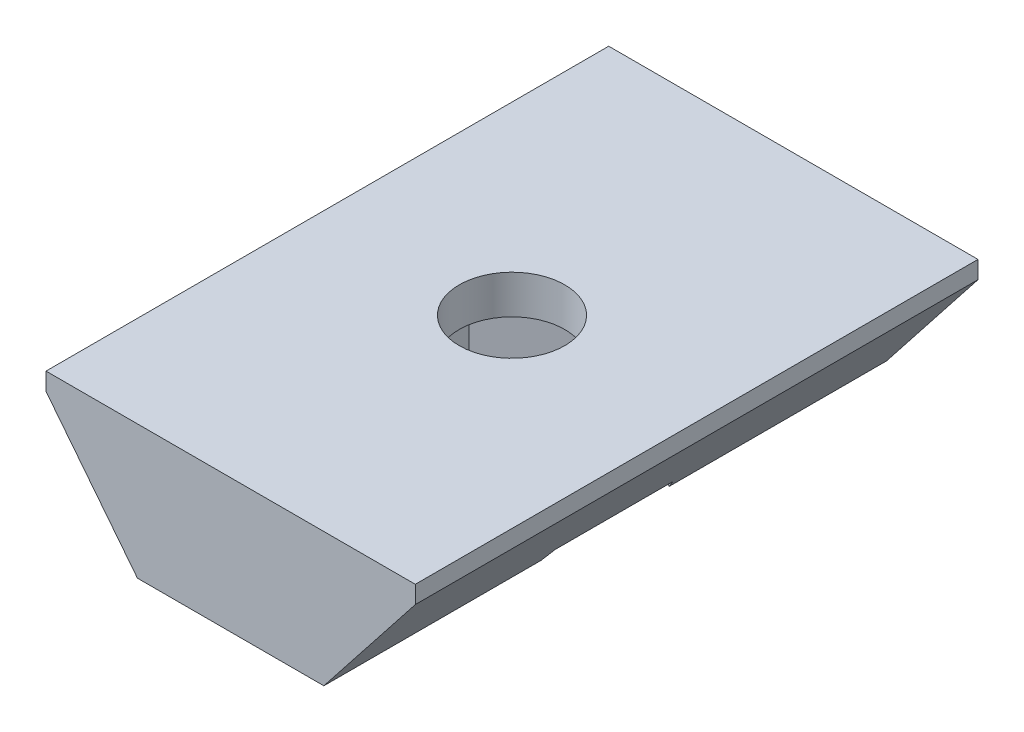
ISO-10303-21;
HEADER;
FILE_DESCRIPTION(('STEP AP214'),'2;1');
FILE_NAME('part.step','',(''),(''),'','','');
FILE_SCHEMA(('AUTOMOTIVE_DESIGN { 1 0 10303 214 1 1 1 1 }'));
ENDSEC;
DATA;
#1=APPLICATION_CONTEXT('core data for automotive mechanical design processes');
#2=APPLICATION_PROTOCOL_DEFINITION('international standard','automotive_design',2000,#1);
#3=PRODUCT_CONTEXT('',#1,'mechanical');
#4=PRODUCT('Part','Part','',(#3));
#5=PRODUCT_RELATED_PRODUCT_CATEGORY('part','',(#4));
#6=PRODUCT_DEFINITION_FORMATION('','',#4);
#7=PRODUCT_DEFINITION_CONTEXT('part definition',#1,'design');
#8=PRODUCT_DEFINITION('design','',#6,#7);
#9=PRODUCT_DEFINITION_SHAPE('','',#8);
#10=(LENGTH_UNIT() NAMED_UNIT(*) SI_UNIT(.MILLI.,.METRE.));
#11=(NAMED_UNIT(*) PLANE_ANGLE_UNIT() SI_UNIT($,.RADIAN.));
#12=(NAMED_UNIT(*) SI_UNIT($,.STERADIAN.) SOLID_ANGLE_UNIT());
#13=UNCERTAINTY_MEASURE_WITH_UNIT(LENGTH_MEASURE(1.E-05),#10,'distance_accuracy_value','');
#14=(GEOMETRIC_REPRESENTATION_CONTEXT(3) GLOBAL_UNCERTAINTY_ASSIGNED_CONTEXT((#13)) GLOBAL_UNIT_ASSIGNED_CONTEXT((#10,
#11,#12)) REPRESENTATION_CONTEXT('',''));
#15=CARTESIAN_POINT('',(0.,0.,0.));
#16=DIRECTION('',(0.,0.,1.));
#17=DIRECTION('',(1.,0.,0.));
#18=AXIS2_PLACEMENT_3D('',#15,#16,#17);
#19=CARTESIAN_POINT('',(-2.65,0.,16.));
#20=DIRECTION('',(0.,1.,0.));
#21=DIRECTION('',(-1.,0.,0.));
#22=AXIS2_PLACEMENT_3D('',#19,#20,#21);
#23=PLANE('',#22);
#24=DIRECTION('',(0.,0.,-1.));
#25=VECTOR('',#24,1.);
#26=CARTESIAN_POINT('',(2.65,0.,16.));
#27=LINE('',#26,#25);
#28=CARTESIAN_POINT('',(2.65,0.,6.18134665205268));
#29=VERTEX_POINT('',#28);
#30=CARTESIAN_POINT('',(2.65,0.,0.));
#31=VERTEX_POINT('',#30);
#32=EDGE_CURVE('E149',#29,#31,#27,.T.);
#33=ORIENTED_EDGE('',*,*,#32,.F.);
#34=DIRECTION('',(0.866025403784438,0.,0.5));
#35=VECTOR('',#34,1.);
#36=CARTESIAN_POINT('',(0.,0.,4.65136843870017));
#37=LINE('',#36,#35);
#38=CARTESIAN_POINT('',(0.,0.,4.65136843870017));
#39=VERTEX_POINT('',#38);
#40=EDGE_CURVE('E50',#39,#29,#37,.T.);
#41=ORIENTED_EDGE('',*,*,#40,.F.);
#42=DIRECTION('',(0.866025403784439,0.,-0.5));
#43=VECTOR('',#42,1.);
#44=CARTESIAN_POINT('',(-2.9,0.,6.32568421935008));
#45=LINE('',#44,#43);
#46=CARTESIAN_POINT('',(-2.65,0.,6.18134665205268));
#47=VERTEX_POINT('',#46);
#48=EDGE_CURVE('E197',#47,#39,#45,.T.);
#49=ORIENTED_EDGE('',*,*,#48,.F.);
#50=DIRECTION('',(0.,0.,-1.));
#51=VECTOR('',#50,1.);
#52=CARTESIAN_POINT('',(-2.65,0.,16.));
#53=LINE('',#52,#51);
#54=CARTESIAN_POINT('',(-2.65,0.,0.));
#55=VERTEX_POINT('',#54);
#56=EDGE_CURVE('E153',#47,#55,#53,.T.);
#57=ORIENTED_EDGE('',*,*,#56,.T.);
#58=DIRECTION('',(1.,0.,0.));
#59=VECTOR('',#58,1.);
#60=CARTESIAN_POINT('',(-2.65,0.,0.));
#61=LINE('',#60,#59);
#62=EDGE_CURVE('E135',#55,#31,#61,.T.);
#63=ORIENTED_EDGE('',*,*,#62,.T.);
#64=EDGE_LOOP('',(#33,#41,#49,#57,#63));
#65=FACE_BOUND('',#64,.T.);
#66=ADVANCED_FACE('F35',(#65),#23,.F.);
#67=CARTESIAN_POINT('',(0.,0.,8.));
#68=DIRECTION('',(0.,1.,0.));
#69=DIRECTION('',(0.,0.,1.));
#70=AXIS2_PLACEMENT_3D('',#67,#68,#69);
#71=CYLINDRICAL_SURFACE('',#70,1.5);
#72=CARTESIAN_POINT('',(0.,3.8,8.));
#73=DIRECTION('',(0.,-1.,0.));
#74=DIRECTION('',(0.,0.,-1.));
#75=AXIS2_PLACEMENT_3D('',#72,#73,#74);
#76=CIRCLE('',#75,1.5);
#77=CARTESIAN_POINT('',(0.,3.8,9.5));
#78=VERTEX_POINT('',#77);
#79=EDGE_CURVE('E136',#78,#78,#76,.T.);
#80=CARTESIAN_POINT('',(0.,2.7,8.));
#81=DIRECTION('',(0.,-1.,0.));
#82=DIRECTION('',(1.,0.,0.));
#83=AXIS2_PLACEMENT_3D('',#80,#81,#82);
#84=CIRCLE('',#83,1.5);
#85=CARTESIAN_POINT('',(0.,2.7,9.5));
#86=VERTEX_POINT('',#85);
#87=EDGE_CURVE('E160',#86,#86,#84,.F.);
#88=CARTESIAN_POINT('',(0.,3.8,9.5));
#89=CARTESIAN_POINT('',(0.,3.78854166666667,9.5));
#90=CARTESIAN_POINT('',(0.,3.77708333333333,9.5));
#91=CARTESIAN_POINT('',(0.,3.75416666666667,9.5));
#92=CARTESIAN_POINT('',(0.,3.74270833333333,9.5));
#93=CARTESIAN_POINT('',(0.,3.71979166666667,9.5));
#94=CARTESIAN_POINT('',(0.,3.70833333333333,9.5));
#95=CARTESIAN_POINT('',(0.,3.68541666666667,9.5));
#96=CARTESIAN_POINT('',(0.,3.67395833333333,9.5));
#97=CARTESIAN_POINT('',(0.,3.65104166666667,9.5));
#98=CARTESIAN_POINT('',(0.,3.63958333333333,9.5));
#99=CARTESIAN_POINT('',(0.,3.61666666666667,9.5));
#100=CARTESIAN_POINT('',(0.,3.60520833333333,9.5));
#101=CARTESIAN_POINT('',(0.,3.58229166666667,9.5));
#102=CARTESIAN_POINT('',(0.,3.57083333333333,9.5));
#103=CARTESIAN_POINT('',(0.,3.54791666666667,9.5));
#104=CARTESIAN_POINT('',(0.,3.53645833333333,9.5));
#105=CARTESIAN_POINT('',(0.,3.51354166666667,9.5));
#106=CARTESIAN_POINT('',(0.,3.50208333333333,9.5));
#107=CARTESIAN_POINT('',(0.,3.47916666666667,9.5));
#108=CARTESIAN_POINT('',(0.,3.46770833333333,9.5));
#109=CARTESIAN_POINT('',(0.,3.44479166666667,9.5));
#110=CARTESIAN_POINT('',(0.,3.43333333333333,9.5));
#111=CARTESIAN_POINT('',(0.,3.41041666666667,9.5));
#112=CARTESIAN_POINT('',(0.,3.39895833333333,9.5));
#113=CARTESIAN_POINT('',(0.,3.37604166666667,9.5));
#114=CARTESIAN_POINT('',(0.,3.36458333333333,9.5));
#115=CARTESIAN_POINT('',(0.,3.34166666666667,9.5));
#116=CARTESIAN_POINT('',(0.,3.33020833333333,9.5));
#117=CARTESIAN_POINT('',(0.,3.30729166666667,9.5));
#118=CARTESIAN_POINT('',(0.,3.29583333333333,9.5));
#119=CARTESIAN_POINT('',(0.,3.27291666666667,9.5));
#120=CARTESIAN_POINT('',(0.,3.26145833333333,9.5));
#121=CARTESIAN_POINT('',(0.,3.23854166666667,9.5));
#122=CARTESIAN_POINT('',(0.,3.22708333333333,9.5));
#123=CARTESIAN_POINT('',(0.,3.20416666666667,9.5));
#124=CARTESIAN_POINT('',(0.,3.19270833333333,9.5));
#125=CARTESIAN_POINT('',(0.,3.16979166666667,9.5));
#126=CARTESIAN_POINT('',(0.,3.15833333333333,9.5));
#127=CARTESIAN_POINT('',(0.,3.13541666666667,9.5));
#128=CARTESIAN_POINT('',(0.,3.12395833333333,9.5));
#129=CARTESIAN_POINT('',(0.,3.10104166666667,9.5));
#130=CARTESIAN_POINT('',(0.,3.08958333333333,9.5));
#131=CARTESIAN_POINT('',(0.,3.06666666666667,9.5));
#132=CARTESIAN_POINT('',(0.,3.05520833333333,9.5));
#133=CARTESIAN_POINT('',(0.,3.03229166666667,9.5));
#134=CARTESIAN_POINT('',(0.,3.02083333333333,9.5));
#135=CARTESIAN_POINT('',(0.,2.99791666666667,9.5));
#136=CARTESIAN_POINT('',(0.,2.98645833333333,9.5));
#137=CARTESIAN_POINT('',(0.,2.96354166666667,9.5));
#138=CARTESIAN_POINT('',(0.,2.95208333333333,9.5));
#139=CARTESIAN_POINT('',(0.,2.92916666666667,9.5));
#140=CARTESIAN_POINT('',(0.,2.91770833333333,9.5));
#141=CARTESIAN_POINT('',(0.,2.89479166666667,9.5));
#142=CARTESIAN_POINT('',(0.,2.88333333333333,9.5));
#143=CARTESIAN_POINT('',(0.,2.86041666666667,9.5));
#144=CARTESIAN_POINT('',(0.,2.84895833333333,9.5));
#145=CARTESIAN_POINT('',(0.,2.82604166666667,9.5));
#146=CARTESIAN_POINT('',(0.,2.81458333333333,9.5));
#147=CARTESIAN_POINT('',(0.,2.79166666666667,9.5));
#148=CARTESIAN_POINT('',(0.,2.78020833333333,9.5));
#149=CARTESIAN_POINT('',(0.,2.75729166666667,9.5));
#150=CARTESIAN_POINT('',(0.,2.74583333333333,9.5));
#151=CARTESIAN_POINT('',(0.,2.72291666666667,9.5));
#152=CARTESIAN_POINT('',(0.,2.71145833333333,9.5));
#153=CARTESIAN_POINT('',(0.,2.7,9.5));
#154=B_SPLINE_CURVE_WITH_KNOTS('',3,(#88,#89,#90,#91,#92,#93,#94,#95,#96,#97,#98,#99,#100,#101,
#102,#103,#104,#105,#106,#107,#108,#109,#110,#111,#112,#113,#114,#115,#116,#117,#118,#119,#120,
#121,#122,#123,#124,#125,#126,#127,#128,#129,#130,#131,#132,#133,#134,#135,#136,#137,#138,#139,
#140,#141,#142,#143,#144,#145,#146,#147,#148,#149,#150,#151,#152,#153),.UNSPECIFIED.,.F.,.F.,(4,
2,2,2,2,2,2,2,2,2,2,2,2,2,2,2,2,2,2,2,2,2,2,2,2,2,2,2,2,2,2,2,4),(0.,0.0343750000000001,
0.0687500000000002,0.103125,0.1375,0.171875,0.20625,0.240625,0.275,0.309375,0.34375,0.378125,
0.4125,0.446875,0.48125,0.515625,0.55,0.584375,0.61875,0.653125,0.6875,0.721875,0.75625,
0.790625,0.825,0.859375,0.89375,0.928125,0.9625,0.996875,1.03125,1.065625,1.1),.UNSPECIFIED.);
#155=EDGE_CURVE('BSEAM304',#78,#86,#154,.T.);
#156=ORIENTED_EDGE('',*,*,#79,.F.);
#157=ORIENTED_EDGE('',*,*,#87,.F.);
#158=ORIENTED_EDGE('',*,*,#155,.T.);
#159=ORIENTED_EDGE('',*,*,#155,.F.);
#160=EDGE_LOOP('',(#156,#158,#157,#159));
#161=FACE_BOUND('',#160,.T.);
#162=ADVANCED_FACE('F304',(#161),#71,.F.);
#163=CARTESIAN_POINT('',(-2.65,0.,16.));
#164=DIRECTION('',(0.785491672227536,0.618872226603513,0.));
#165=DIRECTION('',(-0.618872226603513,0.785491672227536,0.));
#166=AXIS2_PLACEMENT_3D('',#163,#164,#165);
#167=PLANE('',#166);
#168=ORIENTED_EDGE('',*,*,#56,.F.);
#169=DIRECTION('',(-0.582787783907528,0.739692187267247,0.336472683919436));
#170=VECTOR('',#169,1.);
#171=CARTESIAN_POINT('',(-4.57536103958005,2.44372747331314,7.29295436654144));
#172=LINE('',#171,#170);
#173=CARTESIAN_POINT('',(-2.9,0.317307692307695,6.32568421935008));
#174=VERTEX_POINT('',#173);
#175=EDGE_CURVE('E159',#47,#174,#172,.T.);
#176=ORIENTED_EDGE('',*,*,#175,.T.);
#177=DIRECTION('',(0.,0.,1.));
#178=VECTOR('',#177,1.);
#179=CARTESIAN_POINT('',(-2.9,0.317307692307694,16.));
#180=LINE('',#179,#178);
#181=CARTESIAN_POINT('',(-2.9,0.317307692307694,9.67431578064992));
#182=VERTEX_POINT('',#181);
#183=EDGE_CURVE('E11',#174,#182,#180,.T.);
#184=ORIENTED_EDGE('',*,*,#183,.T.);
#185=DIRECTION('',(0.582787783907528,-0.739692187267247,0.336472683919436));
#186=VECTOR('',#185,1.);
#187=CARTESIAN_POINT('',(-1.43788632267083,-1.53845197507164,10.5184675058417));
#188=LINE('',#187,#186);
#189=CARTESIAN_POINT('',(-2.65,0.,9.81865334794732));
#190=VERTEX_POINT('',#189);
#191=EDGE_CURVE('E163',#182,#190,#188,.T.);
#192=ORIENTED_EDGE('',*,*,#191,.T.);
#193=CARTESIAN_POINT('',(-2.65,0.,16.));
#194=VERTEX_POINT('',#193);
#195=EDGE_CURVE('E154',#194,#190,#53,.T.);
#196=ORIENTED_EDGE('',*,*,#195,.F.);
#197=DIRECTION('',(0.618872226603513,-0.785491672227536,0.));
#198=VECTOR('',#197,1.);
#199=CARTESIAN_POINT('',(-2.65,0.,16.));
#200=LINE('',#199,#198);
#201=CARTESIAN_POINT('',(-5.25,3.3,16.));
#202=VERTEX_POINT('',#201);
#203=EDGE_CURVE('E145',#202,#194,#200,.T.);
#204=ORIENTED_EDGE('',*,*,#203,.F.);
#205=DIRECTION('',(0.,0.,-1.));
#206=VECTOR('',#205,1.);
#207=CARTESIAN_POINT('',(-5.25,3.3,16.));
#208=LINE('',#207,#206);
#209=CARTESIAN_POINT('',(-5.25,3.3,0.));
#210=VERTEX_POINT('',#209);
#211=EDGE_CURVE('E128',#202,#210,#208,.T.);
#212=ORIENTED_EDGE('',*,*,#211,.T.);
#213=DIRECTION('',(0.618872226603513,-0.785491672227536,0.));
#214=VECTOR('',#213,1.);
#215=CARTESIAN_POINT('',(-2.65,0.,0.));
#216=LINE('',#215,#214);
#217=EDGE_CURVE('E132',#210,#55,#216,.T.);
#218=ORIENTED_EDGE('',*,*,#217,.T.);
#219=EDGE_LOOP('',(#168,#176,#184,#192,#196,#204,#212,#218));
#220=FACE_BOUND('',#219,.T.);
#221=ADVANCED_FACE('F37',(#220),#167,.F.);
#222=DIRECTION('',(-0.866025403784439,0.,-0.5));
#223=VECTOR('',#222,1.);
#224=CARTESIAN_POINT('',(0.,0.,11.3486315612998));
#225=LINE('',#224,#223);
#226=CARTESIAN_POINT('',(0.,0.,11.3486315612998));
#227=VERTEX_POINT('',#226);
#228=EDGE_CURVE('E195',#227,#190,#225,.T.);
#229=ORIENTED_EDGE('',*,*,#228,.F.);
#230=DIRECTION('',(-0.866025403784439,0.,0.5));
#231=VECTOR('',#230,1.);
#232=CARTESIAN_POINT('',(2.9,0.,9.67431578064992));
#233=LINE('',#232,#231);
#234=CARTESIAN_POINT('',(2.65,0.,9.81865334794732));
#235=VERTEX_POINT('',#234);
#236=EDGE_CURVE('E185',#235,#227,#233,.T.);
#237=ORIENTED_EDGE('',*,*,#236,.F.);
#238=CARTESIAN_POINT('',(2.65,0.,16.));
#239=VERTEX_POINT('',#238);
#240=EDGE_CURVE('E150',#239,#235,#27,.T.);
#241=ORIENTED_EDGE('',*,*,#240,.F.);
#242=DIRECTION('',(1.,0.,0.));
#243=VECTOR('',#242,1.);
#244=CARTESIAN_POINT('',(-2.65,0.,16.));
#245=LINE('',#244,#243);
#246=EDGE_CURVE('E95',#194,#239,#245,.T.);
#247=ORIENTED_EDGE('',*,*,#246,.F.);
#248=ORIENTED_EDGE('',*,*,#195,.T.);
#249=EDGE_LOOP('',(#229,#237,#241,#247,#248));
#250=FACE_BOUND('',#249,.T.);
#251=ADVANCED_FACE('F193',(#250),#23,.F.);
#252=CARTESIAN_POINT('',(5.25,3.3,16.));
#253=DIRECTION('',(-0.785491672227536,0.618872226603513,0.));
#254=DIRECTION('',(-0.618872226603513,-0.785491672227535,0.));
#255=AXIS2_PLACEMENT_3D('',#252,#253,#254);
#256=PLANE('',#255);
#257=ORIENTED_EDGE('',*,*,#240,.T.);
#258=DIRECTION('',(0.582787783907528,0.739692187267247,-0.336472683919437));
#259=VECTOR('',#258,1.);
#260=CARTESIAN_POINT('',(3.74353026840856,1.38794226374933,9.18730335311464));
#261=LINE('',#260,#259);
#262=CARTESIAN_POINT('',(2.9,0.317307692307694,9.67431578064992));
#263=VERTEX_POINT('',#262);
#264=EDGE_CURVE('E43',#235,#263,#261,.T.);
#265=ORIENTED_EDGE('',*,*,#264,.T.);
#266=DIRECTION('',(0.,0.,-1.));
#267=VECTOR('',#266,1.);
#268=CARTESIAN_POINT('',(2.9,0.317307692307691,16.));
#269=LINE('',#268,#267);
#270=CARTESIAN_POINT('',(2.9,0.317307692307695,6.32568421935009));
#271=VERTEX_POINT('',#270);
#272=EDGE_CURVE('E166',#263,#271,#269,.T.);
#273=ORIENTED_EDGE('',*,*,#272,.T.);
#274=DIRECTION('',(-0.582787783907528,-0.739692187267247,-0.336472683919437));
#275=VECTOR('',#274,1.);
#276=CARTESIAN_POINT('',(6.88100498531779,5.37012171213411,8.62411851926855));
#277=LINE('',#276,#275);
#278=EDGE_CURVE('E156',#271,#29,#277,.T.);
#279=ORIENTED_EDGE('',*,*,#278,.T.);
#280=ORIENTED_EDGE('',*,*,#32,.T.);
#281=DIRECTION('',(0.618872226603513,0.785491672227535,0.));
#282=VECTOR('',#281,1.);
#283=CARTESIAN_POINT('',(5.25,3.3,0.));
#284=LINE('',#283,#282);
#285=CARTESIAN_POINT('',(5.25,3.3,0.));
#286=VERTEX_POINT('',#285);
#287=EDGE_CURVE('E139',#31,#286,#284,.T.);
#288=ORIENTED_EDGE('',*,*,#287,.T.);
#289=DIRECTION('',(0.,0.,-1.));
#290=VECTOR('',#289,1.);
#291=CARTESIAN_POINT('',(5.25,3.3,16.));
#292=LINE('',#291,#290);
#293=CARTESIAN_POINT('',(5.25,3.3,16.));
#294=VERTEX_POINT('',#293);
#295=EDGE_CURVE('E123',#294,#286,#292,.T.);
#296=ORIENTED_EDGE('',*,*,#295,.F.);
#297=DIRECTION('',(0.618872226603513,0.785491672227535,0.));
#298=VECTOR('',#297,1.);
#299=CARTESIAN_POINT('',(5.25,3.3,16.));
#300=LINE('',#299,#298);
#301=EDGE_CURVE('E111',#239,#294,#300,.T.);
#302=ORIENTED_EDGE('',*,*,#301,.F.);
#303=EDGE_LOOP('',(#257,#265,#273,#279,#280,#288,#296,#302));
#304=FACE_BOUND('',#303,.T.);
#305=ADVANCED_FACE('F172',(#304),#256,.F.);
#306=CARTESIAN_POINT('',(5.25,3.3,16.));
#307=DIRECTION('',(-1.,0.,0.));
#308=DIRECTION('',(0.,-1.,0.));
#309=AXIS2_PLACEMENT_3D('',#306,#307,#308);
#310=PLANE('',#309);
#311=DIRECTION('',(0.,1.,0.));
#312=VECTOR('',#311,1.);
#313=CARTESIAN_POINT('',(5.25,3.3,0.));
#314=LINE('',#313,#312);
#315=CARTESIAN_POINT('',(5.25,3.8,0.));
#316=VERTEX_POINT('',#315);
#317=EDGE_CURVE('E120',#286,#316,#314,.T.);
#318=ORIENTED_EDGE('',*,*,#317,.T.);
#319=DIRECTION('',(0.,0.,-1.));
#320=VECTOR('',#319,1.);
#321=CARTESIAN_POINT('',(5.25,3.8,16.));
#322=LINE('',#321,#320);
#323=CARTESIAN_POINT('',(5.25,3.8,16.));
#324=VERTEX_POINT('',#323);
#325=EDGE_CURVE('E117',#324,#316,#322,.T.);
#326=ORIENTED_EDGE('',*,*,#325,.F.);
#327=DIRECTION('',(0.,1.,0.));
#328=VECTOR('',#327,1.);
#329=CARTESIAN_POINT('',(5.25,3.3,16.));
#330=LINE('',#329,#328);
#331=EDGE_CURVE('E104',#294,#324,#330,.T.);
#332=ORIENTED_EDGE('',*,*,#331,.F.);
#333=ORIENTED_EDGE('',*,*,#295,.T.);
#334=EDGE_LOOP('',(#318,#326,#332,#333));
#335=FACE_BOUND('',#334,.T.);
#336=ADVANCED_FACE('F118',(#335),#310,.F.);
#337=CARTESIAN_POINT('',(-5.25,3.8,16.));
#338=DIRECTION('',(0.,-1.,0.));
#339=DIRECTION('',(0.,0.,-1.));
#340=AXIS2_PLACEMENT_3D('',#337,#338,#339);
#341=PLANE('',#340);
#342=ORIENTED_EDGE('',*,*,#79,.T.);
#343=EDGE_LOOP('',(#342));
#344=FACE_BOUND('',#343,.T.);
#345=DIRECTION('',(-1.,0.,0.));
#346=VECTOR('',#345,1.);
#347=CARTESIAN_POINT('',(-5.25,3.8,0.));
#348=LINE('',#347,#346);
#349=CARTESIAN_POINT('',(-5.25,3.8,0.));
#350=VERTEX_POINT('',#349);
#351=EDGE_CURVE('E142',#316,#350,#348,.T.);
#352=ORIENTED_EDGE('',*,*,#351,.T.);
#353=DIRECTION('',(0.,0.,-1.));
#354=VECTOR('',#353,1.);
#355=CARTESIAN_POINT('',(-5.25,3.8,16.));
#356=LINE('',#355,#354);
#357=CARTESIAN_POINT('',(-5.25,3.8,16.));
#358=VERTEX_POINT('',#357);
#359=EDGE_CURVE('E124',#358,#350,#356,.T.);
#360=ORIENTED_EDGE('',*,*,#359,.F.);
#361=DIRECTION('',(-1.,0.,0.));
#362=VECTOR('',#361,1.);
#363=CARTESIAN_POINT('',(-5.25,3.8,16.));
#364=LINE('',#363,#362);
#365=EDGE_CURVE('E108',#324,#358,#364,.T.);
#366=ORIENTED_EDGE('',*,*,#365,.F.);
#367=ORIENTED_EDGE('',*,*,#325,.T.);
#368=EDGE_LOOP('',(#352,#360,#366,#367));
#369=FACE_BOUND('',#368,.T.);
#370=ADVANCED_FACE('F126',(#344,#369),#341,.F.);
#371=CARTESIAN_POINT('',(-5.25,3.3,16.));
#372=DIRECTION('',(1.,0.,0.));
#373=DIRECTION('',(0.,1.,0.));
#374=AXIS2_PLACEMENT_3D('',#371,#372,#373);
#375=PLANE('',#374);
#376=DIRECTION('',(0.,-1.,0.));
#377=VECTOR('',#376,1.);
#378=CARTESIAN_POINT('',(-5.25,3.3,0.));
#379=LINE('',#378,#377);
#380=EDGE_CURVE('E86',#350,#210,#379,.T.);
#381=ORIENTED_EDGE('',*,*,#380,.T.);
#382=ORIENTED_EDGE('',*,*,#211,.F.);
#383=DIRECTION('',(0.,-1.,0.));
#384=VECTOR('',#383,1.);
#385=CARTESIAN_POINT('',(-5.25,3.3,16.));
#386=LINE('',#385,#384);
#387=EDGE_CURVE('E59',#358,#202,#386,.T.);
#388=ORIENTED_EDGE('',*,*,#387,.F.);
#389=ORIENTED_EDGE('',*,*,#359,.T.);
#390=EDGE_LOOP('',(#381,#382,#388,#389));
#391=FACE_BOUND('',#390,.T.);
#392=ADVANCED_FACE('F337',(#391),#375,.F.);
#393=CARTESIAN_POINT('',(0.,0.,16.));
#394=DIRECTION('',(0.,0.,1.));
#395=DIRECTION('',(1.,0.,0.));
#396=AXIS2_PLACEMENT_3D('',#393,#394,#395);
#397=PLANE('',#396);
#398=ORIENTED_EDGE('',*,*,#203,.T.);
#399=ORIENTED_EDGE('',*,*,#246,.T.);
#400=ORIENTED_EDGE('',*,*,#301,.T.);
#401=ORIENTED_EDGE('',*,*,#331,.T.);
#402=ORIENTED_EDGE('',*,*,#365,.T.);
#403=ORIENTED_EDGE('',*,*,#387,.T.);
#404=EDGE_LOOP('',(#398,#399,#400,#401,#402,#403));
#405=FACE_BOUND('',#404,.T.);
#406=ADVANCED_FACE('F106',(#405),#397,.T.);
#407=CARTESIAN_POINT('',(0.,0.,0.));
#408=DIRECTION('',(0.,0.,1.));
#409=DIRECTION('',(1.,0.,0.));
#410=AXIS2_PLACEMENT_3D('',#407,#408,#409);
#411=PLANE('',#410);
#412=ORIENTED_EDGE('',*,*,#217,.F.);
#413=ORIENTED_EDGE('',*,*,#380,.F.);
#414=ORIENTED_EDGE('',*,*,#351,.F.);
#415=ORIENTED_EDGE('',*,*,#317,.F.);
#416=ORIENTED_EDGE('',*,*,#287,.F.);
#417=ORIENTED_EDGE('',*,*,#62,.F.);
#418=EDGE_LOOP('',(#412,#413,#414,#415,#416,#417));
#419=FACE_BOUND('',#418,.T.);
#420=ADVANCED_FACE('F259',(#419),#411,.F.);
#421=CARTESIAN_POINT('',(-2.9,2.7,9.67431578064992));
#422=DIRECTION('',(-1.,0.,0.));
#423=DIRECTION('',(0.,-1.,0.));
#424=AXIS2_PLACEMENT_3D('',#421,#422,#423);
#425=PLANE('',#424);
#426=DIRECTION('',(0.,-1.,0.));
#427=VECTOR('',#426,1.);
#428=CARTESIAN_POINT('',(-2.9,2.7,6.32568421935008));
#429=LINE('',#428,#427);
#430=CARTESIAN_POINT('',(-2.9,2.7,6.32568421935008));
#431=VERTEX_POINT('',#430);
#432=EDGE_CURVE('E213',#431,#174,#429,.T.);
#433=ORIENTED_EDGE('',*,*,#432,.F.);
#434=DIRECTION('',(0.,0.,-1.));
#435=VECTOR('',#434,1.);
#436=CARTESIAN_POINT('',(-2.9,2.7,9.67431578064992));
#437=LINE('',#436,#435);
#438=CARTESIAN_POINT('',(-2.9,2.7,9.67431578064992));
#439=VERTEX_POINT('',#438);
#440=EDGE_CURVE('E278',#439,#431,#437,.T.);
#441=ORIENTED_EDGE('',*,*,#440,.F.);
#442=DIRECTION('',(0.,-1.,0.));
#443=VECTOR('',#442,1.);
#444=CARTESIAN_POINT('',(-2.9,2.7,9.67431578064992));
#445=LINE('',#444,#443);
#446=EDGE_CURVE('E216',#439,#182,#445,.T.);
#447=ORIENTED_EDGE('',*,*,#446,.T.);
#448=ORIENTED_EDGE('',*,*,#183,.F.);
#449=EDGE_LOOP('',(#433,#441,#447,#448));
#450=FACE_BOUND('',#449,.T.);
#451=ADVANCED_FACE('F242',(#450),#425,.F.);
#452=CARTESIAN_POINT('',(-2.9,2.7,6.32568421935008));
#453=DIRECTION('',(-0.5,0.,-0.866025403784439));
#454=DIRECTION('',(-0.866025403784439,0.,0.5));
#455=AXIS2_PLACEMENT_3D('',#452,#453,#454);
#456=PLANE('',#455);
#457=ORIENTED_EDGE('',*,*,#48,.T.);
#458=DIRECTION('',(0.,-1.,0.));
#459=VECTOR('',#458,1.);
#460=CARTESIAN_POINT('',(0.,2.7,4.65136843870017));
#461=LINE('',#460,#459);
#462=CARTESIAN_POINT('',(0.,2.7,4.65136843870017));
#463=VERTEX_POINT('',#462);
#464=EDGE_CURVE('E211',#463,#39,#461,.T.);
#465=ORIENTED_EDGE('',*,*,#464,.F.);
#466=DIRECTION('',(0.866025403784439,0.,-0.5));
#467=VECTOR('',#466,1.);
#468=CARTESIAN_POINT('',(-2.9,2.7,6.32568421935008));
#469=LINE('',#468,#467);
#470=EDGE_CURVE('E251',#431,#463,#469,.T.);
#471=ORIENTED_EDGE('',*,*,#470,.F.);
#472=ORIENTED_EDGE('',*,*,#432,.T.);
#473=ORIENTED_EDGE('',*,*,#175,.F.);
#474=EDGE_LOOP('',(#457,#465,#471,#472,#473));
#475=FACE_BOUND('',#474,.T.);
#476=ADVANCED_FACE('F247',(#475),#456,.F.);
#477=CARTESIAN_POINT('',(0.,2.7,11.3486315612998));
#478=DIRECTION('',(-0.5,0.,0.866025403784439));
#479=DIRECTION('',(0.866025403784439,0.,0.5));
#480=AXIS2_PLACEMENT_3D('',#477,#478,#479);
#481=PLANE('',#480);
#482=ORIENTED_EDGE('',*,*,#446,.F.);
#483=DIRECTION('',(-0.866025403784439,0.,-0.5));
#484=VECTOR('',#483,1.);
#485=CARTESIAN_POINT('',(0.,2.7,11.3486315612998));
#486=LINE('',#485,#484);
#487=CARTESIAN_POINT('',(0.,2.7,11.3486315612998));
#488=VERTEX_POINT('',#487);
#489=EDGE_CURVE('E276',#488,#439,#486,.T.);
#490=ORIENTED_EDGE('',*,*,#489,.F.);
#491=DIRECTION('',(0.,-1.,0.));
#492=VECTOR('',#491,1.);
#493=CARTESIAN_POINT('',(0.,2.7,11.3486315612998));
#494=LINE('',#493,#492);
#495=EDGE_CURVE('E219',#488,#227,#494,.T.);
#496=ORIENTED_EDGE('',*,*,#495,.T.);
#497=ORIENTED_EDGE('',*,*,#228,.T.);
#498=ORIENTED_EDGE('',*,*,#191,.F.);
#499=EDGE_LOOP('',(#482,#490,#496,#497,#498));
#500=FACE_BOUND('',#499,.T.);
#501=ADVANCED_FACE('F274',(#500),#481,.F.);
#502=CARTESIAN_POINT('',(2.9,2.7,9.67431578064992));
#503=DIRECTION('',(0.5,0.,0.866025403784439));
#504=DIRECTION('',(0.866025403784439,0.,-0.5));
#505=AXIS2_PLACEMENT_3D('',#502,#503,#504);
#506=PLANE('',#505);
#507=ORIENTED_EDGE('',*,*,#236,.T.);
#508=ORIENTED_EDGE('',*,*,#495,.F.);
#509=DIRECTION('',(-0.866025403784439,0.,0.5));
#510=VECTOR('',#509,1.);
#511=CARTESIAN_POINT('',(2.9,2.7,9.67431578064992));
#512=LINE('',#511,#510);
#513=CARTESIAN_POINT('',(2.9,2.7,9.67431578064992));
#514=VERTEX_POINT('',#513);
#515=EDGE_CURVE('E206',#514,#488,#512,.T.);
#516=ORIENTED_EDGE('',*,*,#515,.F.);
#517=DIRECTION('',(0.,-1.,0.));
#518=VECTOR('',#517,1.);
#519=CARTESIAN_POINT('',(2.9,2.7,9.67431578064992));
#520=LINE('',#519,#518);
#521=EDGE_CURVE('E164',#514,#263,#520,.T.);
#522=ORIENTED_EDGE('',*,*,#521,.T.);
#523=ORIENTED_EDGE('',*,*,#264,.F.);
#524=EDGE_LOOP('',(#507,#508,#516,#522,#523));
#525=FACE_BOUND('',#524,.T.);
#526=ADVANCED_FACE('F182',(#525),#506,.F.);
#527=CARTESIAN_POINT('',(2.9,2.7,6.32568421935009));
#528=DIRECTION('',(1.,0.,0.));
#529=DIRECTION('',(0.,0.,-1.));
#530=AXIS2_PLACEMENT_3D('',#527,#528,#529);
#531=PLANE('',#530);
#532=ORIENTED_EDGE('',*,*,#521,.F.);
#533=DIRECTION('',(0.,0.,1.));
#534=VECTOR('',#533,1.);
#535=CARTESIAN_POINT('',(2.9,2.7,6.32568421935009));
#536=LINE('',#535,#534);
#537=CARTESIAN_POINT('',(2.9,2.7,6.32568421935009));
#538=VERTEX_POINT('',#537);
#539=EDGE_CURVE('E200',#538,#514,#536,.T.);
#540=ORIENTED_EDGE('',*,*,#539,.F.);
#541=DIRECTION('',(0.,-1.,0.));
#542=VECTOR('',#541,1.);
#543=CARTESIAN_POINT('',(2.9,2.7,6.32568421935009));
#544=LINE('',#543,#542);
#545=EDGE_CURVE('E208',#538,#271,#544,.T.);
#546=ORIENTED_EDGE('',*,*,#545,.T.);
#547=ORIENTED_EDGE('',*,*,#272,.F.);
#548=EDGE_LOOP('',(#532,#540,#546,#547));
#549=FACE_BOUND('',#548,.T.);
#550=ADVANCED_FACE('F292',(#549),#531,.F.);
#551=CARTESIAN_POINT('',(0.,2.7,4.65136843870017));
#552=DIRECTION('',(0.5,0.,-0.866025403784438));
#553=DIRECTION('',(-0.866025403784438,0.,-0.500000000000001));
#554=AXIS2_PLACEMENT_3D('',#551,#552,#553);
#555=PLANE('',#554);
#556=ORIENTED_EDGE('',*,*,#545,.F.);
#557=DIRECTION('',(0.866025403784438,0.,0.5));
#558=VECTOR('',#557,1.);
#559=CARTESIAN_POINT('',(0.,2.7,4.65136843870017));
#560=LINE('',#559,#558);
#561=EDGE_CURVE('E287',#463,#538,#560,.T.);
#562=ORIENTED_EDGE('',*,*,#561,.F.);
#563=ORIENTED_EDGE('',*,*,#464,.T.);
#564=ORIENTED_EDGE('',*,*,#40,.T.);
#565=ORIENTED_EDGE('',*,*,#278,.F.);
#566=EDGE_LOOP('',(#556,#562,#563,#564,#565));
#567=FACE_BOUND('',#566,.T.);
#568=ADVANCED_FACE('F293',(#567),#555,.F.);
#569=CARTESIAN_POINT('',(0.,2.7,0.));
#570=DIRECTION('',(0.,-1.,0.));
#571=DIRECTION('',(1.,0.,0.));
#572=AXIS2_PLACEMENT_3D('',#569,#570,#571);
#573=PLANE('',#572);
#574=ORIENTED_EDGE('',*,*,#515,.T.);
#575=ORIENTED_EDGE('',*,*,#489,.T.);
#576=ORIENTED_EDGE('',*,*,#440,.T.);
#577=ORIENTED_EDGE('',*,*,#470,.T.);
#578=ORIENTED_EDGE('',*,*,#561,.T.);
#579=ORIENTED_EDGE('',*,*,#539,.T.);
#580=EDGE_LOOP('',(#574,#575,#576,#577,#578,#579));
#581=FACE_BOUND('',#580,.T.);
#582=ORIENTED_EDGE('',*,*,#87,.T.);
#583=EDGE_LOOP('',(#582));
#584=FACE_BOUND('',#583,.T.);
#585=ADVANCED_FACE('F281',(#581,#584),#573,.T.);
#586=CLOSED_SHELL('',(#66,#162,#221,#251,#305,#336,#370,#392,#406,#420,#451,#476,#501,#526,#550,
#568,#585));
#587=MANIFOLD_SOLID_BREP('B2',#586);
#588=ADVANCED_BREP_SHAPE_REPRESENTATION('',(#18,#587),#14);
#589=SHAPE_DEFINITION_REPRESENTATION(#9,#588);
ENDSEC;
END-ISO-10303-21;
